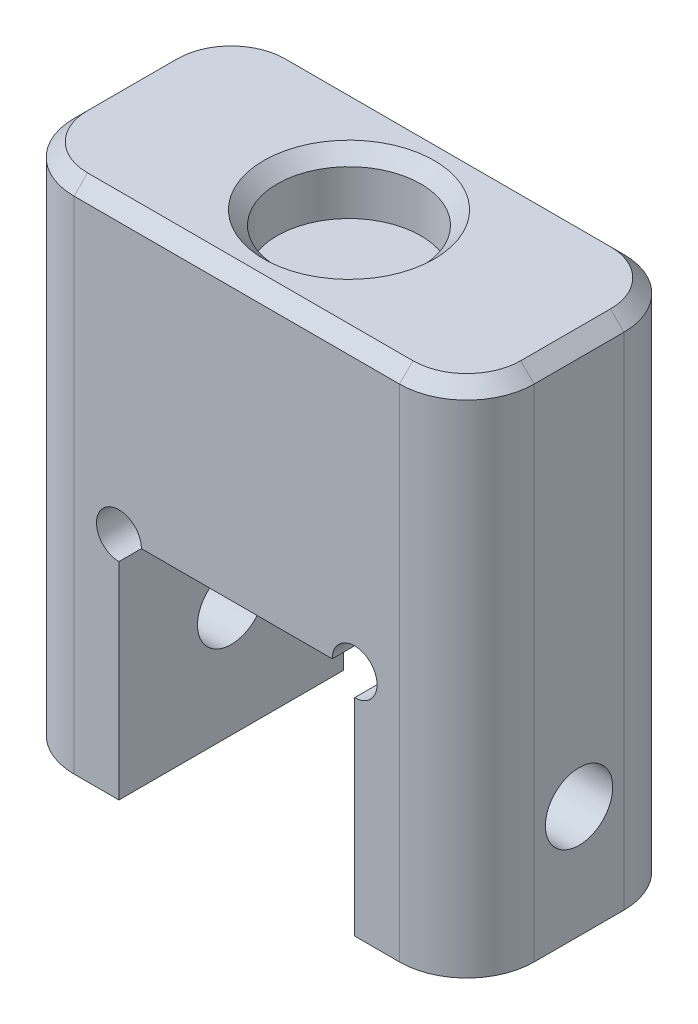
ISO-10303-21;
HEADER;
FILE_DESCRIPTION(('STEP AP214'),'2;1');
FILE_NAME('part.step','',(''),(''),'','','');
FILE_SCHEMA(('AUTOMOTIVE_DESIGN { 1 0 10303 214 1 1 1 1 }'));
ENDSEC;
DATA;
#1=APPLICATION_CONTEXT('core data for automotive mechanical design processes');
#2=APPLICATION_PROTOCOL_DEFINITION('international standard','automotive_design',2000,#1);
#3=PRODUCT_CONTEXT('',#1,'mechanical');
#4=PRODUCT('Part','Part','',(#3));
#5=PRODUCT_RELATED_PRODUCT_CATEGORY('part','',(#4));
#6=PRODUCT_DEFINITION_FORMATION('','',#4);
#7=PRODUCT_DEFINITION_CONTEXT('part definition',#1,'design');
#8=PRODUCT_DEFINITION('design','',#6,#7);
#9=PRODUCT_DEFINITION_SHAPE('','',#8);
#10=(LENGTH_UNIT() NAMED_UNIT(*) SI_UNIT(.MILLI.,.METRE.));
#11=(NAMED_UNIT(*) PLANE_ANGLE_UNIT() SI_UNIT($,.RADIAN.));
#12=(NAMED_UNIT(*) SI_UNIT($,.STERADIAN.) SOLID_ANGLE_UNIT());
#13=UNCERTAINTY_MEASURE_WITH_UNIT(LENGTH_MEASURE(1.E-05),#10,'distance_accuracy_value','');
#14=(GEOMETRIC_REPRESENTATION_CONTEXT(3) GLOBAL_UNCERTAINTY_ASSIGNED_CONTEXT((#13)) GLOBAL_UNIT_ASSIGNED_CONTEXT((#10,
#11,#12)) REPRESENTATION_CONTEXT('',''));
#15=CARTESIAN_POINT('',(0.,0.,0.));
#16=DIRECTION('',(0.,0.,1.));
#17=DIRECTION('',(1.,0.,0.));
#18=AXIS2_PLACEMENT_3D('',#15,#16,#17);
#19=CARTESIAN_POINT('',(0.,-1.24999999999999,10.));
#20=DIRECTION('',(0.,1.,0.));
#21=DIRECTION('',(0.,0.,1.));
#22=AXIS2_PLACEMENT_3D('',#19,#20,#21);
#23=PLANE('',#22);
#24=DIRECTION('',(1.,0.,0.));
#25=VECTOR('',#24,1.);
#26=CARTESIAN_POINT('',(0.,-1.24999999999999,0.));
#27=LINE('',#26,#25);
#28=CARTESIAN_POINT('',(-4.24999999999999,-1.24999999999999,0.));
#29=VERTEX_POINT('',#28);
#30=CARTESIAN_POINT('',(4.25000000000001,-1.24999999999999,0.));
#31=VERTEX_POINT('',#30);
#32=EDGE_CURVE('E188',#29,#31,#27,.T.);
#33=ORIENTED_EDGE('',*,*,#32,.T.);
#34=DIRECTION('',(0.,0.,1.));
#35=VECTOR('',#34,1.);
#36=CARTESIAN_POINT('',(4.25000000000001,-1.24999999999999,0.));
#37=LINE('',#36,#35);
#38=CARTESIAN_POINT('',(4.25000000000001,-1.24999999999999,10.));
#39=VERTEX_POINT('',#38);
#40=EDGE_CURVE('E322',#31,#39,#37,.T.);
#41=ORIENTED_EDGE('',*,*,#40,.T.);
#42=DIRECTION('',(1.,0.,0.));
#43=VECTOR('',#42,1.);
#44=CARTESIAN_POINT('',(0.,-1.24999999999999,10.));
#45=LINE('',#44,#43);
#46=CARTESIAN_POINT('',(-4.24999999999999,-1.24999999999999,10.));
#47=VERTEX_POINT('',#46);
#48=EDGE_CURVE('E190',#47,#39,#45,.T.);
#49=ORIENTED_EDGE('',*,*,#48,.F.);
#50=DIRECTION('',(0.,0.,1.));
#51=VECTOR('',#50,1.);
#52=CARTESIAN_POINT('',(-4.24999999999999,-1.24999999999999,0.));
#53=LINE('',#52,#51);
#54=EDGE_CURVE('E173',#47,#29,#53,.F.);
#55=ORIENTED_EDGE('',*,*,#54,.T.);
#56=EDGE_LOOP('',(#33,#41,#49,#55));
#57=FACE_BOUND('',#56,.T.);
#58=ADVANCED_FACE('F41',(#57),#23,.F.);
#59=CARTESIAN_POINT('',(5.25000000000001,0.,10.));
#60=DIRECTION('',(1.,0.,0.));
#61=DIRECTION('',(0.,1.,0.));
#62=AXIS2_PLACEMENT_3D('',#59,#60,#61);
#63=PLANE('',#62);
#64=CARTESIAN_POINT('',(5.25000000000001,-6.44999999999999,5.));
#65=DIRECTION('',(1.,0.,0.));
#66=DIRECTION('',(0.,1.,0.));
#67=AXIS2_PLACEMENT_3D('',#64,#65,#66);
#68=CIRCLE('',#67,1.5);
#69=CARTESIAN_POINT('',(5.25000000000001,-4.94999999999999,5.));
#70=VERTEX_POINT('',#69);
#71=EDGE_CURVE('E203',#70,#70,#68,.T.);
#72=ORIENTED_EDGE('',*,*,#71,.T.);
#73=EDGE_LOOP('',(#72));
#74=FACE_BOUND('',#73,.T.);
#75=DIRECTION('',(0.,-1.,0.));
#76=VECTOR('',#75,1.);
#77=CARTESIAN_POINT('',(5.25000000000001,0.,10.));
#78=LINE('',#77,#76);
#79=CARTESIAN_POINT('',(5.25000000000001,-2.24999999999999,10.));
#80=VERTEX_POINT('',#79);
#81=CARTESIAN_POINT('',(5.25000000000001,-11.45,10.));
#82=VERTEX_POINT('',#81);
#83=EDGE_CURVE('E332',#80,#82,#78,.T.);
#84=ORIENTED_EDGE('',*,*,#83,.F.);
#85=DIRECTION('',(0.,0.,1.));
#86=VECTOR('',#85,1.);
#87=CARTESIAN_POINT('',(5.25000000000001,-2.24999999999999,0.));
#88=LINE('',#87,#86);
#89=CARTESIAN_POINT('',(5.25000000000001,-2.24999999999999,0.));
#90=VERTEX_POINT('',#89);
#91=EDGE_CURVE('E191',#80,#90,#88,.F.);
#92=ORIENTED_EDGE('',*,*,#91,.T.);
#93=DIRECTION('',(0.,-1.,0.));
#94=VECTOR('',#93,1.);
#95=CARTESIAN_POINT('',(5.25000000000001,0.,0.));
#96=LINE('',#95,#94);
#97=CARTESIAN_POINT('',(5.25000000000001,-11.45,0.));
#98=VERTEX_POINT('',#97);
#99=EDGE_CURVE('E197',#90,#98,#96,.T.);
#100=ORIENTED_EDGE('',*,*,#99,.T.);
#101=DIRECTION('',(0.,0.,-1.));
#102=VECTOR('',#101,1.);
#103=CARTESIAN_POINT('',(5.25000000000001,-11.45,10.));
#104=LINE('',#103,#102);
#105=EDGE_CURVE('E223',#82,#98,#104,.T.);
#106=ORIENTED_EDGE('',*,*,#105,.F.);
#107=EDGE_LOOP('',(#84,#92,#100,#106));
#108=FACE_BOUND('',#107,.T.);
#109=ADVANCED_FACE('F431',(#74,#108),#63,.F.);
#110=CARTESIAN_POINT('',(0.,-11.45,10.));
#111=DIRECTION('',(0.,1.,0.));
#112=DIRECTION('',(-1.,0.,0.));
#113=AXIS2_PLACEMENT_3D('',#110,#111,#112);
#114=PLANE('',#113);
#115=DIRECTION('',(1.,0.,0.));
#116=VECTOR('',#115,1.);
#117=CARTESIAN_POINT('',(0.,-11.45,0.));
#118=LINE('',#117,#116);
#119=CARTESIAN_POINT('',(7.25000000000001,-11.45,0.));
#120=VERTEX_POINT('',#119);
#121=EDGE_CURVE('E200',#98,#120,#118,.T.);
#122=ORIENTED_EDGE('',*,*,#121,.T.);
#123=CARTESIAN_POINT('',(7.25000000000001,-11.45,3.));
#124=DIRECTION('',(0.,1.,0.));
#125=DIRECTION('',(-1.,0.,0.));
#126=AXIS2_PLACEMENT_3D('',#123,#124,#125);
#127=CIRCLE('',#126,3.);
#128=CARTESIAN_POINT('',(10.25,-11.45,3.));
#129=VERTEX_POINT('',#128);
#130=EDGE_CURVE('E255',#120,#129,#127,.F.);
#131=ORIENTED_EDGE('',*,*,#130,.T.);
#132=DIRECTION('',(0.,0.,-1.));
#133=VECTOR('',#132,1.);
#134=CARTESIAN_POINT('',(10.25,-11.45,10.));
#135=LINE('',#134,#133);
#136=CARTESIAN_POINT('',(10.25,-11.45,7.));
#137=VERTEX_POINT('',#136);
#138=EDGE_CURVE('E220',#137,#129,#135,.T.);
#139=ORIENTED_EDGE('',*,*,#138,.F.);
#140=CARTESIAN_POINT('',(7.25000000000001,-11.45,7.));
#141=DIRECTION('',(0.,1.,0.));
#142=DIRECTION('',(-1.,0.,0.));
#143=AXIS2_PLACEMENT_3D('',#140,#141,#142);
#144=CIRCLE('',#143,3.);
#145=CARTESIAN_POINT('',(7.25000000000001,-11.45,10.));
#146=VERTEX_POINT('',#145);
#147=EDGE_CURVE('E253',#137,#146,#144,.F.);
#148=ORIENTED_EDGE('',*,*,#147,.T.);
#149=DIRECTION('',(1.,0.,0.));
#150=VECTOR('',#149,1.);
#151=CARTESIAN_POINT('',(0.,-11.45,10.));
#152=LINE('',#151,#150);
#153=EDGE_CURVE('E333',#82,#146,#152,.T.);
#154=ORIENTED_EDGE('',*,*,#153,.F.);
#155=ORIENTED_EDGE('',*,*,#105,.T.);
#156=EDGE_LOOP('',(#122,#131,#139,#148,#154,#155));
#157=FACE_BOUND('',#156,.T.);
#158=ADVANCED_FACE('F436',(#157),#114,.F.);
#159=CARTESIAN_POINT('',(10.25,0.,10.));
#160=DIRECTION('',(-1.,0.,0.));
#161=DIRECTION('',(0.,-1.,0.));
#162=AXIS2_PLACEMENT_3D('',#159,#160,#161);
#163=PLANE('',#162);
#164=CARTESIAN_POINT('',(10.25,-6.44999999999999,5.));
#165=DIRECTION('',(1.,0.,0.));
#166=DIRECTION('',(0.,1.,0.));
#167=AXIS2_PLACEMENT_3D('',#164,#165,#166);
#168=CIRCLE('',#167,1.5);
#169=CARTESIAN_POINT('',(10.25,-4.94999999999999,5.));
#170=VERTEX_POINT('',#169);
#171=EDGE_CURVE('E324',#170,#170,#168,.T.);
#172=ORIENTED_EDGE('',*,*,#171,.F.);
#173=EDGE_LOOP('',(#172));
#174=FACE_BOUND('',#173,.T.);
#175=DIRECTION('',(0.,1.,0.));
#176=VECTOR('',#175,1.);
#177=CARTESIAN_POINT('',(10.25,0.,3.));
#178=LINE('',#177,#176);
#179=CARTESIAN_POINT('',(10.25,10.85,3.));
#180=VERTEX_POINT('',#179);
#181=EDGE_CURVE('E250',#129,#180,#178,.T.);
#182=ORIENTED_EDGE('',*,*,#181,.T.);
#183=DIRECTION('',(0.,0.,1.));
#184=VECTOR('',#183,1.);
#185=CARTESIAN_POINT('',(10.25,10.85,7.));
#186=LINE('',#185,#184);
#187=CARTESIAN_POINT('',(10.25,10.85,7.));
#188=VERTEX_POINT('',#187);
#189=EDGE_CURVE('E280',#180,#188,#186,.T.);
#190=ORIENTED_EDGE('',*,*,#189,.T.);
#191=DIRECTION('',(0.,1.,0.));
#192=VECTOR('',#191,1.);
#193=CARTESIAN_POINT('',(10.25,-11.45,7.));
#194=LINE('',#193,#192);
#195=EDGE_CURVE('E248',#188,#137,#194,.F.);
#196=ORIENTED_EDGE('',*,*,#195,.T.);
#197=ORIENTED_EDGE('',*,*,#138,.T.);
#198=EDGE_LOOP('',(#182,#190,#196,#197));
#199=FACE_BOUND('',#198,.T.);
#200=ADVANCED_FACE('F382',(#174,#199),#163,.F.);
#201=CARTESIAN_POINT('',(0.,11.45,10.));
#202=DIRECTION('',(0.,1.,0.));
#203=DIRECTION('',(-1.,0.,0.));
#204=AXIS2_PLACEMENT_3D('',#201,#202,#203);
#205=PLANE('',#204);
#206=DIRECTION('',(0.,0.,-1.));
#207=VECTOR('',#206,1.);
#208=CARTESIAN_POINT('',(9.65000000000001,11.45,3.));
#209=LINE('',#208,#207);
#210=CARTESIAN_POINT('',(9.65000000000001,11.45,7.));
#211=VERTEX_POINT('',#210);
#212=CARTESIAN_POINT('',(9.65000000000001,11.45,3.));
#213=VERTEX_POINT('',#212);
#214=EDGE_CURVE('E272',#211,#213,#209,.T.);
#215=ORIENTED_EDGE('',*,*,#214,.T.);
#216=CARTESIAN_POINT('',(7.25000000000001,11.45,3.));
#217=DIRECTION('',(0.,1.,0.));
#218=DIRECTION('',(-1.,0.,0.));
#219=AXIS2_PLACEMENT_3D('',#216,#217,#218);
#220=CIRCLE('',#219,2.4);
#221=CARTESIAN_POINT('',(7.25000000000001,11.45,0.6));
#222=VERTEX_POINT('',#221);
#223=EDGE_CURVE('E274',#213,#222,#220,.T.);
#224=ORIENTED_EDGE('',*,*,#223,.T.);
#225=DIRECTION('',(-1.,0.,0.));
#226=VECTOR('',#225,1.);
#227=CARTESIAN_POINT('',(-7.25000000000001,11.45,0.6));
#228=LINE('',#227,#226);
#229=CARTESIAN_POINT('',(-7.25000000000001,11.45,0.6));
#230=VERTEX_POINT('',#229);
#231=EDGE_CURVE('E260',#222,#230,#228,.T.);
#232=ORIENTED_EDGE('',*,*,#231,.T.);
#233=CARTESIAN_POINT('',(-7.25000000000001,11.45,3.));
#234=DIRECTION('',(0.,1.,0.));
#235=DIRECTION('',(-1.,0.,0.));
#236=AXIS2_PLACEMENT_3D('',#233,#234,#235);
#237=CIRCLE('',#236,2.4);
#238=CARTESIAN_POINT('',(-9.65000000000001,11.45,3.));
#239=VERTEX_POINT('',#238);
#240=EDGE_CURVE('E262',#230,#239,#237,.T.);
#241=ORIENTED_EDGE('',*,*,#240,.T.);
#242=DIRECTION('',(0.,0.,1.));
#243=VECTOR('',#242,1.);
#244=CARTESIAN_POINT('',(-9.65000000000001,11.45,10.));
#245=LINE('',#244,#243);
#246=CARTESIAN_POINT('',(-9.65000000000001,11.45,7.));
#247=VERTEX_POINT('',#246);
#248=EDGE_CURVE('E264',#239,#247,#245,.T.);
#249=ORIENTED_EDGE('',*,*,#248,.T.);
#250=CARTESIAN_POINT('',(-7.25000000000001,11.45,7.));
#251=DIRECTION('',(0.,1.,0.));
#252=DIRECTION('',(-1.,0.,0.));
#253=AXIS2_PLACEMENT_3D('',#250,#251,#252);
#254=CIRCLE('',#253,2.4);
#255=CARTESIAN_POINT('',(-7.25000000000001,11.45,9.4));
#256=VERTEX_POINT('',#255);
#257=EDGE_CURVE('E266',#247,#256,#254,.T.);
#258=ORIENTED_EDGE('',*,*,#257,.T.);
#259=DIRECTION('',(1.,0.,0.));
#260=VECTOR('',#259,1.);
#261=CARTESIAN_POINT('',(0.,11.45,9.4));
#262=LINE('',#261,#260);
#263=CARTESIAN_POINT('',(7.25000000000001,11.45,9.4));
#264=VERTEX_POINT('',#263);
#265=EDGE_CURVE('E268',#256,#264,#262,.T.);
#266=ORIENTED_EDGE('',*,*,#265,.T.);
#267=CARTESIAN_POINT('',(7.25000000000001,11.45,7.));
#268=DIRECTION('',(0.,1.,0.));
#269=DIRECTION('',(-1.,0.,0.));
#270=AXIS2_PLACEMENT_3D('',#267,#268,#269);
#271=CIRCLE('',#270,2.4);
#272=EDGE_CURVE('E270',#264,#211,#271,.T.);
#273=ORIENTED_EDGE('',*,*,#272,.T.);
#274=EDGE_LOOP('',(#215,#224,#232,#241,#249,#258,#266,#273));
#275=FACE_BOUND('',#274,.T.);
#276=CARTESIAN_POINT('',(0.,11.45,5.));
#277=DIRECTION('',(0.,1.,0.));
#278=DIRECTION('',(-1.,0.,0.));
#279=AXIS2_PLACEMENT_3D('',#276,#277,#278);
#280=CIRCLE('',#279,3.8);
#281=CARTESIAN_POINT('',(-3.8,11.45,5.));
#282=VERTEX_POINT('',#281);
#283=EDGE_CURVE('E257',#282,#282,#280,.F.);
#284=ORIENTED_EDGE('',*,*,#283,.T.);
#285=EDGE_LOOP('',(#284));
#286=FACE_BOUND('',#285,.T.);
#287=ADVANCED_FACE('F403',(#275,#286),#205,.T.);
#288=CARTESIAN_POINT('',(-10.25,0.,10.));
#289=DIRECTION('',(-1.,0.,0.));
#290=DIRECTION('',(0.,-1.,0.));
#291=AXIS2_PLACEMENT_3D('',#288,#289,#290);
#292=PLANE('',#291);
#293=CARTESIAN_POINT('',(-10.25,-6.44999999999999,5.));
#294=DIRECTION('',(1.,0.,0.));
#295=DIRECTION('',(0.,1.,0.));
#296=AXIS2_PLACEMENT_3D('',#293,#294,#295);
#297=CIRCLE('',#296,1.5);
#298=CARTESIAN_POINT('',(-10.25,-4.94999999999999,5.));
#299=VERTEX_POINT('',#298);
#300=EDGE_CURVE('E229',#299,#299,#297,.T.);
#301=ORIENTED_EDGE('',*,*,#300,.T.);
#302=EDGE_LOOP('',(#301));
#303=FACE_BOUND('',#302,.T.);
#304=DIRECTION('',(0.,1.,0.));
#305=VECTOR('',#304,1.);
#306=CARTESIAN_POINT('',(-10.25,0.,7.));
#307=LINE('',#306,#305);
#308=CARTESIAN_POINT('',(-10.25,-11.45,7.));
#309=VERTEX_POINT('',#308);
#310=CARTESIAN_POINT('',(-10.25,10.85,7.));
#311=VERTEX_POINT('',#310);
#312=EDGE_CURVE('E235',#309,#311,#307,.T.);
#313=ORIENTED_EDGE('',*,*,#312,.T.);
#314=DIRECTION('',(0.,0.,-1.));
#315=VECTOR('',#314,1.);
#316=CARTESIAN_POINT('',(-10.25,10.85,10.));
#317=LINE('',#316,#315);
#318=CARTESIAN_POINT('',(-10.25,10.85,3.));
#319=VERTEX_POINT('',#318);
#320=EDGE_CURVE('E67',#311,#319,#317,.T.);
#321=ORIENTED_EDGE('',*,*,#320,.T.);
#322=DIRECTION('',(0.,1.,0.));
#323=VECTOR('',#322,1.);
#324=CARTESIAN_POINT('',(-10.25,-11.45,3.));
#325=LINE('',#324,#323);
#326=CARTESIAN_POINT('',(-10.25,-11.45,3.));
#327=VERTEX_POINT('',#326);
#328=EDGE_CURVE('E237',#319,#327,#325,.F.);
#329=ORIENTED_EDGE('',*,*,#328,.T.);
#330=DIRECTION('',(0.,0.,-1.));
#331=VECTOR('',#330,1.);
#332=CARTESIAN_POINT('',(-10.25,-11.45,10.));
#333=LINE('',#332,#331);
#334=EDGE_CURVE('E217',#309,#327,#333,.T.);
#335=ORIENTED_EDGE('',*,*,#334,.F.);
#336=EDGE_LOOP('',(#313,#321,#329,#335));
#337=FACE_BOUND('',#336,.T.);
#338=ADVANCED_FACE('F406',(#303,#337),#292,.T.);
#339=ORIENTED_EDGE('',*,*,#334,.T.);
#340=CARTESIAN_POINT('',(-7.25,-11.45,3.));
#341=DIRECTION('',(0.,1.,0.));
#342=DIRECTION('',(-1.,0.,0.));
#343=AXIS2_PLACEMENT_3D('',#340,#341,#342);
#344=CIRCLE('',#343,3.);
#345=CARTESIAN_POINT('',(-7.25,-11.45,0.));
#346=VERTEX_POINT('',#345);
#347=EDGE_CURVE('E241',#327,#346,#344,.F.);
#348=ORIENTED_EDGE('',*,*,#347,.T.);
#349=CARTESIAN_POINT('',(-5.24999999999999,-11.45,0.));
#350=VERTEX_POINT('',#349);
#351=EDGE_CURVE('E211',#346,#350,#118,.T.);
#352=ORIENTED_EDGE('',*,*,#351,.T.);
#353=DIRECTION('',(0.,0.,-1.));
#354=VECTOR('',#353,1.);
#355=CARTESIAN_POINT('',(-5.24999999999999,-11.45,10.));
#356=LINE('',#355,#354);
#357=CARTESIAN_POINT('',(-5.24999999999999,-11.45,10.));
#358=VERTEX_POINT('',#357);
#359=EDGE_CURVE('E214',#358,#350,#356,.T.);
#360=ORIENTED_EDGE('',*,*,#359,.F.);
#361=CARTESIAN_POINT('',(-7.25,-11.45,10.));
#362=VERTEX_POINT('',#361);
#363=EDGE_CURVE('E335',#362,#358,#152,.T.);
#364=ORIENTED_EDGE('',*,*,#363,.F.);
#365=CARTESIAN_POINT('',(-7.25,-11.45,7.));
#366=DIRECTION('',(0.,1.,0.));
#367=DIRECTION('',(-1.,0.,0.));
#368=AXIS2_PLACEMENT_3D('',#365,#366,#367);
#369=CIRCLE('',#368,3.);
#370=EDGE_CURVE('E239',#362,#309,#369,.F.);
#371=ORIENTED_EDGE('',*,*,#370,.T.);
#372=EDGE_LOOP('',(#339,#348,#352,#360,#364,#371));
#373=FACE_BOUND('',#372,.T.);
#374=ADVANCED_FACE('F347',(#373),#114,.F.);
#375=CARTESIAN_POINT('',(-5.25,0.,10.));
#376=DIRECTION('',(1.,0.,0.));
#377=DIRECTION('',(0.,1.,0.));
#378=AXIS2_PLACEMENT_3D('',#375,#376,#377);
#379=PLANE('',#378);
#380=DIRECTION('',(0.,0.,1.));
#381=VECTOR('',#380,1.);
#382=CARTESIAN_POINT('',(-5.25,-2.24999999999999,0.));
#383=LINE('',#382,#381);
#384=CARTESIAN_POINT('',(-5.25,-2.24999999999999,10.));
#385=VERTEX_POINT('',#384);
#386=CARTESIAN_POINT('',(-5.25,-2.24999999999999,0.));
#387=VERTEX_POINT('',#386);
#388=EDGE_CURVE('E176',#385,#387,#383,.F.);
#389=ORIENTED_EDGE('',*,*,#388,.F.);
#390=DIRECTION('',(0.,-1.,0.));
#391=VECTOR('',#390,1.);
#392=CARTESIAN_POINT('',(-5.25,0.,10.));
#393=LINE('',#392,#391);
#394=EDGE_CURVE('E206',#385,#358,#393,.T.);
#395=ORIENTED_EDGE('',*,*,#394,.T.);
#396=ORIENTED_EDGE('',*,*,#359,.T.);
#397=DIRECTION('',(0.,-1.,0.));
#398=VECTOR('',#397,1.);
#399=CARTESIAN_POINT('',(-5.25,0.,0.));
#400=LINE('',#399,#398);
#401=EDGE_CURVE('E212',#387,#350,#400,.T.);
#402=ORIENTED_EDGE('',*,*,#401,.F.);
#403=EDGE_LOOP('',(#389,#395,#396,#402));
#404=FACE_BOUND('',#403,.T.);
#405=CARTESIAN_POINT('',(-5.24999999999999,-6.44999999999999,5.));
#406=DIRECTION('',(1.,0.,0.));
#407=DIRECTION('',(0.,1.,0.));
#408=AXIS2_PLACEMENT_3D('',#405,#406,#407);
#409=CIRCLE('',#408,1.5);
#410=CARTESIAN_POINT('',(-5.24999999999999,-4.94999999999999,5.));
#411=VERTEX_POINT('',#410);
#412=EDGE_CURVE('E226',#411,#411,#409,.T.);
#413=ORIENTED_EDGE('',*,*,#412,.F.);
#414=EDGE_LOOP('',(#413));
#415=FACE_BOUND('',#414,.T.);
#416=ADVANCED_FACE('F344',(#404,#415),#379,.T.);
#417=CARTESIAN_POINT('',(0.,0.,10.));
#418=DIRECTION('',(0.,0.,1.));
#419=DIRECTION('',(1.,0.,0.));
#420=AXIS2_PLACEMENT_3D('',#417,#418,#419);
#421=PLANE('',#420);
#422=DIRECTION('',(0.,1.,0.));
#423=VECTOR('',#422,1.);
#424=CARTESIAN_POINT('',(7.25000000000001,11.45,10.));
#425=LINE('',#424,#423);
#426=CARTESIAN_POINT('',(7.25000000000001,10.85,10.));
#427=VERTEX_POINT('',#426);
#428=EDGE_CURVE('E243',#146,#427,#425,.T.);
#429=ORIENTED_EDGE('',*,*,#428,.T.);
#430=DIRECTION('',(-1.,0.,0.));
#431=VECTOR('',#430,1.);
#432=CARTESIAN_POINT('',(0.,10.85,10.));
#433=LINE('',#432,#431);
#434=CARTESIAN_POINT('',(-7.25000000000001,10.85,10.));
#435=VERTEX_POINT('',#434);
#436=EDGE_CURVE('E284',#427,#435,#433,.T.);
#437=ORIENTED_EDGE('',*,*,#436,.T.);
#438=DIRECTION('',(0.,1.,0.));
#439=VECTOR('',#438,1.);
#440=CARTESIAN_POINT('',(-7.25000000000001,0.,10.));
#441=LINE('',#440,#439);
#442=EDGE_CURVE('E246',#435,#362,#441,.F.);
#443=ORIENTED_EDGE('',*,*,#442,.T.);
#444=ORIENTED_EDGE('',*,*,#363,.T.);
#445=ORIENTED_EDGE('',*,*,#394,.F.);
#446=CARTESIAN_POINT('',(-5.25,-1.24999999999999,10.));
#447=DIRECTION('',(0.,0.,1.));
#448=DIRECTION('',(1.,0.,0.));
#449=AXIS2_PLACEMENT_3D('',#446,#447,#448);
#450=CIRCLE('',#449,1.);
#451=EDGE_CURVE('E182',#47,#385,#450,.T.);
#452=ORIENTED_EDGE('',*,*,#451,.F.);
#453=ORIENTED_EDGE('',*,*,#48,.T.);
#454=CARTESIAN_POINT('',(5.25000000000001,-1.24999999999999,10.));
#455=DIRECTION('',(0.,0.,1.));
#456=DIRECTION('',(1.,0.,0.));
#457=AXIS2_PLACEMENT_3D('',#454,#455,#456);
#458=CIRCLE('',#457,1.);
#459=EDGE_CURVE('E181',#80,#39,#458,.T.);
#460=ORIENTED_EDGE('',*,*,#459,.F.);
#461=ORIENTED_EDGE('',*,*,#83,.T.);
#462=ORIENTED_EDGE('',*,*,#153,.T.);
#463=EDGE_LOOP('',(#429,#437,#443,#444,#445,#452,#453,#460,#461,#462));
#464=FACE_BOUND('',#463,.T.);
#465=ADVANCED_FACE('F394',(#464),#421,.T.);
#466=CARTESIAN_POINT('',(0.,0.,0.));
#467=DIRECTION('',(0.,0.,1.));
#468=DIRECTION('',(1.,0.,0.));
#469=AXIS2_PLACEMENT_3D('',#466,#467,#468);
#470=PLANE('',#469);
#471=DIRECTION('',(0.,1.,0.));
#472=VECTOR('',#471,1.);
#473=CARTESIAN_POINT('',(-7.25000000000001,11.45,0.));
#474=LINE('',#473,#472);
#475=CARTESIAN_POINT('',(-7.25000000000001,10.85,0.));
#476=VERTEX_POINT('',#475);
#477=EDGE_CURVE('E233',#346,#476,#474,.T.);
#478=ORIENTED_EDGE('',*,*,#477,.T.);
#479=DIRECTION('',(1.,0.,0.));
#480=VECTOR('',#479,1.);
#481=CARTESIAN_POINT('',(7.25000000000001,10.85,0.));
#482=LINE('',#481,#480);
#483=CARTESIAN_POINT('',(7.25000000000001,10.85,0.));
#484=VERTEX_POINT('',#483);
#485=EDGE_CURVE('E51',#476,#484,#482,.T.);
#486=ORIENTED_EDGE('',*,*,#485,.T.);
#487=DIRECTION('',(0.,1.,0.));
#488=VECTOR('',#487,1.);
#489=CARTESIAN_POINT('',(7.25000000000001,0.,0.));
#490=LINE('',#489,#488);
#491=EDGE_CURVE('E231',#484,#120,#490,.F.);
#492=ORIENTED_EDGE('',*,*,#491,.T.);
#493=ORIENTED_EDGE('',*,*,#121,.F.);
#494=ORIENTED_EDGE('',*,*,#99,.F.);
#495=CARTESIAN_POINT('',(5.25000000000001,-1.24999999999999,0.));
#496=DIRECTION('',(0.,0.,1.));
#497=DIRECTION('',(1.,0.,0.));
#498=AXIS2_PLACEMENT_3D('',#495,#496,#497);
#499=CIRCLE('',#498,1.);
#500=EDGE_CURVE('E196',#90,#31,#499,.T.);
#501=ORIENTED_EDGE('',*,*,#500,.T.);
#502=ORIENTED_EDGE('',*,*,#32,.F.);
#503=CARTESIAN_POINT('',(-5.25,-1.24999999999999,0.));
#504=DIRECTION('',(0.,0.,1.));
#505=DIRECTION('',(1.,0.,0.));
#506=AXIS2_PLACEMENT_3D('',#503,#504,#505);
#507=CIRCLE('',#506,1.);
#508=EDGE_CURVE('E170',#29,#387,#507,.T.);
#509=ORIENTED_EDGE('',*,*,#508,.T.);
#510=ORIENTED_EDGE('',*,*,#401,.T.);
#511=ORIENTED_EDGE('',*,*,#351,.F.);
#512=EDGE_LOOP('',(#478,#486,#492,#493,#494,#501,#502,#509,#510,#511));
#513=FACE_BOUND('',#512,.T.);
#514=ADVANCED_FACE('F194',(#513),#470,.F.);
#515=CARTESIAN_POINT('',(0.,8.85000000000001,5.));
#516=DIRECTION('',(0.,1.,0.));
#517=DIRECTION('',(-1.,0.,0.));
#518=AXIS2_PLACEMENT_3D('',#515,#516,#517);
#519=CYLINDRICAL_SURFACE('',#518,3.2);
#520=CARTESIAN_POINT('',(0.,10.85,5.));
#521=DIRECTION('',(0.,1.,0.));
#522=DIRECTION('',(-1.,0.,0.));
#523=AXIS2_PLACEMENT_3D('',#520,#521,#522);
#524=CIRCLE('',#523,3.2);
#525=CARTESIAN_POINT('',(-3.2,10.85,5.));
#526=VERTEX_POINT('',#525);
#527=EDGE_CURVE('E11',#526,#526,#524,.T.);
#528=ORIENTED_EDGE('',*,*,#527,.T.);
#529=EDGE_LOOP('',(#528));
#530=FACE_BOUND('',#529,.T.);
#531=CARTESIAN_POINT('',(0.,8.85000000000001,5.));
#532=DIRECTION('',(0.,1.,0.));
#533=DIRECTION('',(-1.,0.,0.));
#534=AXIS2_PLACEMENT_3D('',#531,#532,#533);
#535=CIRCLE('',#534,3.2);
#536=CARTESIAN_POINT('',(-3.2,8.85000000000001,5.));
#537=VERTEX_POINT('',#536);
#538=EDGE_CURVE('E198',#537,#537,#535,.T.);
#539=ORIENTED_EDGE('',*,*,#538,.F.);
#540=EDGE_LOOP('',(#539));
#541=FACE_BOUND('',#540,.T.);
#542=ADVANCED_FACE('F414',(#530,#541),#519,.F.);
#543=CARTESIAN_POINT('',(0.,8.85000000000001,5.));
#544=DIRECTION('',(0.,1.,0.));
#545=DIRECTION('',(-1.,0.,0.));
#546=AXIS2_PLACEMENT_3D('',#543,#544,#545);
#547=PLANE('',#546);
#548=ORIENTED_EDGE('',*,*,#538,.T.);
#549=EDGE_LOOP('',(#548));
#550=FACE_BOUND('',#549,.T.);
#551=ADVANCED_FACE('F417',(#550),#547,.T.);
#552=CARTESIAN_POINT('',(-10.25,-6.44999999999999,5.));
#553=DIRECTION('',(1.,0.,0.));
#554=DIRECTION('',(0.,1.,0.));
#555=AXIS2_PLACEMENT_3D('',#552,#553,#554);
#556=CYLINDRICAL_SURFACE('',#555,1.5);
#557=CARTESIAN_POINT('',(-5.24999999999999,-4.94999999999999,5.));
#558=CARTESIAN_POINT('',(-5.30208333333333,-4.94999999999999,5.));
#559=CARTESIAN_POINT('',(-5.35416666666666,-4.94999999999999,5.));
#560=CARTESIAN_POINT('',(-5.45833333333333,-4.94999999999999,5.));
#561=CARTESIAN_POINT('',(-5.51041666666666,-4.94999999999999,5.));
#562=CARTESIAN_POINT('',(-5.61458333333333,-4.94999999999999,5.));
#563=CARTESIAN_POINT('',(-5.66666666666666,-4.94999999999999,5.));
#564=CARTESIAN_POINT('',(-5.77083333333333,-4.94999999999999,5.));
#565=CARTESIAN_POINT('',(-5.82291666666666,-4.94999999999999,5.));
#566=CARTESIAN_POINT('',(-5.92708333333333,-4.94999999999999,5.));
#567=CARTESIAN_POINT('',(-5.97916666666666,-4.94999999999999,5.));
#568=CARTESIAN_POINT('',(-6.08333333333333,-4.94999999999999,5.));
#569=CARTESIAN_POINT('',(-6.13541666666666,-4.94999999999999,5.));
#570=CARTESIAN_POINT('',(-6.23958333333333,-4.94999999999999,5.));
#571=CARTESIAN_POINT('',(-6.29166666666666,-4.94999999999999,5.));
#572=CARTESIAN_POINT('',(-6.39583333333333,-4.94999999999999,5.));
#573=CARTESIAN_POINT('',(-6.44791666666667,-4.94999999999999,5.));
#574=CARTESIAN_POINT('',(-6.55208333333333,-4.94999999999999,5.));
#575=CARTESIAN_POINT('',(-6.60416666666667,-4.94999999999999,5.));
#576=CARTESIAN_POINT('',(-6.70833333333333,-4.94999999999999,5.));
#577=CARTESIAN_POINT('',(-6.76041666666667,-4.94999999999999,5.));
#578=CARTESIAN_POINT('',(-6.86458333333333,-4.94999999999999,5.));
#579=CARTESIAN_POINT('',(-6.91666666666667,-4.94999999999999,5.));
#580=CARTESIAN_POINT('',(-7.02083333333333,-4.94999999999999,5.));
#581=CARTESIAN_POINT('',(-7.07291666666667,-4.94999999999999,5.));
#582=CARTESIAN_POINT('',(-7.17708333333333,-4.94999999999999,5.));
#583=CARTESIAN_POINT('',(-7.22916666666667,-4.94999999999999,5.));
#584=CARTESIAN_POINT('',(-7.33333333333333,-4.94999999999999,5.));
#585=CARTESIAN_POINT('',(-7.38541666666667,-4.94999999999999,5.));
#586=CARTESIAN_POINT('',(-7.48958333333334,-4.94999999999999,5.));
#587=CARTESIAN_POINT('',(-7.54166666666667,-4.94999999999999,5.));
#588=CARTESIAN_POINT('',(-7.64583333333334,-4.94999999999999,5.));
#589=CARTESIAN_POINT('',(-7.69791666666667,-4.94999999999999,5.));
#590=CARTESIAN_POINT('',(-7.80208333333334,-4.94999999999999,5.));
#591=CARTESIAN_POINT('',(-7.85416666666667,-4.94999999999999,5.));
#592=CARTESIAN_POINT('',(-7.95833333333334,-4.94999999999999,5.));
#593=CARTESIAN_POINT('',(-8.01041666666667,-4.94999999999999,5.));
#594=CARTESIAN_POINT('',(-8.11458333333334,-4.94999999999999,5.));
#595=CARTESIAN_POINT('',(-8.16666666666667,-4.94999999999999,5.));
#596=CARTESIAN_POINT('',(-8.27083333333334,-4.94999999999999,5.));
#597=CARTESIAN_POINT('',(-8.32291666666667,-4.94999999999999,5.));
#598=CARTESIAN_POINT('',(-8.42708333333334,-4.94999999999999,5.));
#599=CARTESIAN_POINT('',(-8.47916666666667,-4.94999999999999,5.));
#600=CARTESIAN_POINT('',(-8.58333333333334,-4.94999999999999,5.));
#601=CARTESIAN_POINT('',(-8.63541666666667,-4.94999999999999,5.));
#602=CARTESIAN_POINT('',(-8.73958333333334,-4.94999999999999,5.));
#603=CARTESIAN_POINT('',(-8.79166666666667,-4.94999999999999,5.));
#604=CARTESIAN_POINT('',(-8.89583333333334,-4.94999999999999,5.));
#605=CARTESIAN_POINT('',(-8.94791666666667,-4.94999999999999,5.));
#606=CARTESIAN_POINT('',(-9.05208333333334,-4.94999999999999,5.));
#607=CARTESIAN_POINT('',(-9.10416666666667,-4.94999999999999,5.));
#608=CARTESIAN_POINT('',(-9.20833333333334,-4.94999999999999,5.));
#609=CARTESIAN_POINT('',(-9.26041666666668,-4.94999999999999,5.));
#610=CARTESIAN_POINT('',(-9.36458333333334,-4.94999999999999,5.));
#611=CARTESIAN_POINT('',(-9.41666666666668,-4.94999999999999,5.));
#612=CARTESIAN_POINT('',(-9.52083333333334,-4.94999999999999,5.));
#613=CARTESIAN_POINT('',(-9.57291666666668,-4.94999999999999,5.));
#614=CARTESIAN_POINT('',(-9.67708333333334,-4.94999999999999,5.));
#615=CARTESIAN_POINT('',(-9.72916666666668,-4.94999999999999,5.));
#616=CARTESIAN_POINT('',(-9.83333333333334,-4.94999999999999,5.));
#617=CARTESIAN_POINT('',(-9.88541666666668,-4.94999999999999,5.));
#618=CARTESIAN_POINT('',(-9.98958333333334,-4.94999999999999,5.));
#619=CARTESIAN_POINT('',(-10.0416666666667,-4.94999999999999,5.));
#620=CARTESIAN_POINT('',(-10.1458333333333,-4.94999999999999,5.));
#621=CARTESIAN_POINT('',(-10.1979166666667,-4.94999999999999,5.));
#622=CARTESIAN_POINT('',(-10.25,-4.94999999999999,5.));
#623=B_SPLINE_CURVE_WITH_KNOTS('',3,(#557,#558,#559,#560,#561,#562,#563,#564,#565,#566,#567,
#568,#569,#570,#571,#572,#573,#574,#575,#576,#577,#578,#579,#580,#581,#582,#583,#584,#585,#586,
#587,#588,#589,#590,#591,#592,#593,#594,#595,#596,#597,#598,#599,#600,#601,#602,#603,#604,#605,
#606,#607,#608,#609,#610,#611,#612,#613,#614,#615,#616,#617,#618,#619,#620,#621,#622),
.UNSPECIFIED.,.F.,.F.,(4,2,2,2,2,2,2,2,2,2,2,2,2,2,2,2,2,2,2,2,2,2,2,2,2,2,2,2,2,2,2,2,4),(0.,
0.156250000000001,0.312500000000001,0.468750000000002,0.625000000000002,0.781250000000003,
0.937500000000004,1.09375,1.25000000000001,1.40625000000001,1.56250000000001,1.71875000000001,
1.87500000000001,2.03125000000001,2.18750000000001,2.34375000000001,2.50000000000001,
2.65625000000001,2.81250000000001,2.96875000000001,3.12500000000001,3.28125000000001,
3.43750000000001,3.59375000000001,3.75000000000001,3.90625000000002,4.06250000000002,
4.21875000000002,4.37500000000002,4.53125000000002,4.68750000000002,4.84375000000002,
5.00000000000002),.UNSPECIFIED.);
#624=EDGE_CURVE('BSEAM422',#411,#299,#623,.T.);
#625=ORIENTED_EDGE('',*,*,#412,.T.);
#626=ORIENTED_EDGE('',*,*,#300,.F.);
#627=ORIENTED_EDGE('',*,*,#624,.T.);
#628=ORIENTED_EDGE('',*,*,#624,.F.);
#629=EDGE_LOOP('',(#625,#627,#626,#628));
#630=FACE_BOUND('',#629,.T.);
#631=ADVANCED_FACE('F422',(#630),#556,.F.);
#632=CARTESIAN_POINT('',(10.25,-4.94999999999999,5.));
#633=CARTESIAN_POINT('',(10.1979166666667,-4.94999999999999,5.));
#634=CARTESIAN_POINT('',(10.1458333333333,-4.94999999999999,5.));
#635=CARTESIAN_POINT('',(10.0416666666667,-4.94999999999999,5.));
#636=CARTESIAN_POINT('',(9.98958333333335,-4.94999999999999,5.));
#637=CARTESIAN_POINT('',(9.88541666666668,-4.94999999999999,5.));
#638=CARTESIAN_POINT('',(9.83333333333335,-4.94999999999999,5.));
#639=CARTESIAN_POINT('',(9.72916666666668,-4.94999999999999,5.));
#640=CARTESIAN_POINT('',(9.67708333333335,-4.94999999999999,5.));
#641=CARTESIAN_POINT('',(9.57291666666668,-4.94999999999999,5.));
#642=CARTESIAN_POINT('',(9.52083333333335,-4.94999999999999,5.));
#643=CARTESIAN_POINT('',(9.41666666666668,-4.94999999999999,5.));
#644=CARTESIAN_POINT('',(9.36458333333335,-4.94999999999999,5.));
#645=CARTESIAN_POINT('',(9.26041666666668,-4.94999999999999,5.));
#646=CARTESIAN_POINT('',(9.20833333333335,-4.94999999999999,5.));
#647=CARTESIAN_POINT('',(9.10416666666668,-4.94999999999999,5.));
#648=CARTESIAN_POINT('',(9.05208333333335,-4.94999999999999,5.));
#649=CARTESIAN_POINT('',(8.94791666666668,-4.94999999999999,5.));
#650=CARTESIAN_POINT('',(8.89583333333335,-4.94999999999999,5.));
#651=CARTESIAN_POINT('',(8.79166666666668,-4.94999999999999,5.));
#652=CARTESIAN_POINT('',(8.73958333333335,-4.94999999999999,5.));
#653=CARTESIAN_POINT('',(8.63541666666668,-4.94999999999999,5.));
#654=CARTESIAN_POINT('',(8.58333333333335,-4.94999999999999,5.));
#655=CARTESIAN_POINT('',(8.47916666666668,-4.94999999999999,5.));
#656=CARTESIAN_POINT('',(8.42708333333334,-4.94999999999999,5.));
#657=CARTESIAN_POINT('',(8.32291666666668,-4.94999999999999,5.));
#658=CARTESIAN_POINT('',(8.27083333333334,-4.94999999999999,5.));
#659=CARTESIAN_POINT('',(8.16666666666668,-4.94999999999999,5.));
#660=CARTESIAN_POINT('',(8.11458333333334,-4.94999999999999,5.));
#661=CARTESIAN_POINT('',(8.01041666666668,-4.94999999999999,5.));
#662=CARTESIAN_POINT('',(7.95833333333334,-4.94999999999999,5.));
#663=CARTESIAN_POINT('',(7.85416666666668,-4.94999999999999,5.));
#664=CARTESIAN_POINT('',(7.80208333333334,-4.94999999999999,5.));
#665=CARTESIAN_POINT('',(7.69791666666668,-4.94999999999999,5.));
#666=CARTESIAN_POINT('',(7.64583333333334,-4.94999999999999,5.));
#667=CARTESIAN_POINT('',(7.54166666666668,-4.94999999999999,5.));
#668=CARTESIAN_POINT('',(7.48958333333334,-4.94999999999999,5.));
#669=CARTESIAN_POINT('',(7.38541666666668,-4.94999999999999,5.));
#670=CARTESIAN_POINT('',(7.33333333333334,-4.94999999999999,5.));
#671=CARTESIAN_POINT('',(7.22916666666667,-4.94999999999999,5.));
#672=CARTESIAN_POINT('',(7.17708333333334,-4.94999999999999,5.));
#673=CARTESIAN_POINT('',(7.07291666666667,-4.94999999999999,5.));
#674=CARTESIAN_POINT('',(7.02083333333334,-4.94999999999999,5.));
#675=CARTESIAN_POINT('',(6.91666666666667,-4.94999999999999,5.));
#676=CARTESIAN_POINT('',(6.86458333333334,-4.94999999999999,5.));
#677=CARTESIAN_POINT('',(6.76041666666667,-4.94999999999999,5.));
#678=CARTESIAN_POINT('',(6.70833333333334,-4.94999999999999,5.));
#679=CARTESIAN_POINT('',(6.60416666666667,-4.94999999999999,5.));
#680=CARTESIAN_POINT('',(6.55208333333334,-4.94999999999999,5.));
#681=CARTESIAN_POINT('',(6.44791666666667,-4.94999999999999,5.));
#682=CARTESIAN_POINT('',(6.39583333333334,-4.94999999999999,5.));
#683=CARTESIAN_POINT('',(6.29166666666667,-4.94999999999999,5.));
#684=CARTESIAN_POINT('',(6.23958333333334,-4.94999999999999,5.));
#685=CARTESIAN_POINT('',(6.13541666666667,-4.94999999999999,5.));
#686=CARTESIAN_POINT('',(6.08333333333334,-4.94999999999999,5.));
#687=CARTESIAN_POINT('',(5.97916666666667,-4.94999999999999,5.));
#688=CARTESIAN_POINT('',(5.92708333333334,-4.94999999999999,5.));
#689=CARTESIAN_POINT('',(5.82291666666667,-4.94999999999999,5.));
#690=CARTESIAN_POINT('',(5.77083333333334,-4.94999999999999,5.));
#691=CARTESIAN_POINT('',(5.66666666666667,-4.94999999999999,5.));
#692=CARTESIAN_POINT('',(5.61458333333334,-4.94999999999999,5.));
#693=CARTESIAN_POINT('',(5.51041666666667,-4.94999999999999,5.));
#694=CARTESIAN_POINT('',(5.45833333333334,-4.94999999999999,5.));
#695=CARTESIAN_POINT('',(5.35416666666667,-4.94999999999999,5.));
#696=CARTESIAN_POINT('',(5.30208333333334,-4.94999999999999,5.));
#697=CARTESIAN_POINT('',(5.25000000000001,-4.94999999999999,5.));
#698=B_SPLINE_CURVE_WITH_KNOTS('',3,(#632,#633,#634,#635,#636,#637,#638,#639,#640,#641,#642,
#643,#644,#645,#646,#647,#648,#649,#650,#651,#652,#653,#654,#655,#656,#657,#658,#659,#660,#661,
#662,#663,#664,#665,#666,#667,#668,#669,#670,#671,#672,#673,#674,#675,#676,#677,#678,#679,#680,
#681,#682,#683,#684,#685,#686,#687,#688,#689,#690,#691,#692,#693,#694,#695,#696,#697),
.UNSPECIFIED.,.F.,.F.,(4,2,2,2,2,2,2,2,2,2,2,2,2,2,2,2,2,2,2,2,2,2,2,2,2,2,2,2,2,2,2,2,4),(0.,
0.15625,0.3125,0.46875,0.625000000000001,0.781250000000001,0.937500000000001,1.09375,1.25,
1.40625,1.5625,1.71875,1.875,2.03125,2.1875,2.34375000000001,2.5,2.65625000000001,2.8125,
2.96875000000001,3.12500000000001,3.28125000000001,3.43750000000001,3.59375000000001,
3.75000000000001,3.90625000000001,4.06250000000001,4.21875000000001,4.37500000000001,
4.53125000000001,4.68750000000001,4.84375000000001,5.00000000000001),.UNSPECIFIED.);
#699=EDGE_CURVE('BSEAM427',#170,#70,#698,.T.);
#700=ORIENTED_EDGE('',*,*,#171,.T.);
#701=ORIENTED_EDGE('',*,*,#71,.F.);
#702=ORIENTED_EDGE('',*,*,#699,.T.);
#703=ORIENTED_EDGE('',*,*,#699,.F.);
#704=EDGE_LOOP('',(#700,#702,#701,#703));
#705=FACE_BOUND('',#704,.T.);
#706=ADVANCED_FACE('F427',(#705),#556,.F.);
#707=CARTESIAN_POINT('',(-5.25,-1.24999999999999,0.));
#708=DIRECTION('',(0.,0.,1.));
#709=DIRECTION('',(1.,0.,0.));
#710=AXIS2_PLACEMENT_3D('',#707,#708,#709);
#711=CYLINDRICAL_SURFACE('',#710,1.);
#712=ORIENTED_EDGE('',*,*,#451,.T.);
#713=ORIENTED_EDGE('',*,*,#388,.T.);
#714=ORIENTED_EDGE('',*,*,#508,.F.);
#715=ORIENTED_EDGE('',*,*,#54,.F.);
#716=EDGE_LOOP('',(#712,#713,#714,#715));
#717=FACE_BOUND('',#716,.T.);
#718=ADVANCED_FACE('F172',(#717),#711,.F.);
#719=CARTESIAN_POINT('',(5.25000000000001,-1.24999999999999,0.));
#720=DIRECTION('',(0.,0.,1.));
#721=DIRECTION('',(1.,0.,0.));
#722=AXIS2_PLACEMENT_3D('',#719,#720,#721);
#723=CYLINDRICAL_SURFACE('',#722,1.);
#724=ORIENTED_EDGE('',*,*,#500,.F.);
#725=ORIENTED_EDGE('',*,*,#91,.F.);
#726=ORIENTED_EDGE('',*,*,#459,.T.);
#727=ORIENTED_EDGE('',*,*,#40,.F.);
#728=EDGE_LOOP('',(#724,#725,#726,#727));
#729=FACE_BOUND('',#728,.T.);
#730=ADVANCED_FACE('F443',(#729),#723,.F.);
#731=CARTESIAN_POINT('',(-7.25000000000001,0.,3.));
#732=DIRECTION('',(0.,-1.,0.));
#733=DIRECTION('',(1.,0.,0.));
#734=AXIS2_PLACEMENT_3D('',#731,#732,#733);
#735=CYLINDRICAL_SURFACE('',#734,3.);
#736=ORIENTED_EDGE('',*,*,#328,.F.);
#737=CARTESIAN_POINT('',(-7.25000000000001,10.85,3.));
#738=DIRECTION('',(0.,1.,0.));
#739=DIRECTION('',(0.,0.,1.));
#740=AXIS2_PLACEMENT_3D('',#737,#738,#739);
#741=CIRCLE('',#740,3.);
#742=EDGE_CURVE('E59',#319,#476,#741,.F.);
#743=ORIENTED_EDGE('',*,*,#742,.T.);
#744=ORIENTED_EDGE('',*,*,#477,.F.);
#745=ORIENTED_EDGE('',*,*,#347,.F.);
#746=EDGE_LOOP('',(#736,#743,#744,#745));
#747=FACE_BOUND('',#746,.T.);
#748=ADVANCED_FACE('F352',(#747),#735,.T.);
#749=CARTESIAN_POINT('',(-7.25000000000001,0.,7.));
#750=DIRECTION('',(0.,1.,0.));
#751=DIRECTION('',(-1.,0.,0.));
#752=AXIS2_PLACEMENT_3D('',#749,#750,#751);
#753=CYLINDRICAL_SURFACE('',#752,3.);
#754=ORIENTED_EDGE('',*,*,#442,.F.);
#755=CARTESIAN_POINT('',(-7.25000000000001,10.85,7.));
#756=DIRECTION('',(0.,1.,0.));
#757=DIRECTION('',(0.,0.,1.));
#758=AXIS2_PLACEMENT_3D('',#755,#756,#757);
#759=CIRCLE('',#758,3.);
#760=EDGE_CURVE('E286',#435,#311,#759,.F.);
#761=ORIENTED_EDGE('',*,*,#760,.T.);
#762=ORIENTED_EDGE('',*,*,#312,.F.);
#763=ORIENTED_EDGE('',*,*,#370,.F.);
#764=EDGE_LOOP('',(#754,#761,#762,#763));
#765=FACE_BOUND('',#764,.T.);
#766=ADVANCED_FACE('F397',(#765),#753,.T.);
#767=CARTESIAN_POINT('',(7.25000000000001,0.,3.));
#768=DIRECTION('',(0.,1.,0.));
#769=DIRECTION('',(-1.,0.,0.));
#770=AXIS2_PLACEMENT_3D('',#767,#768,#769);
#771=CYLINDRICAL_SURFACE('',#770,3.);
#772=ORIENTED_EDGE('',*,*,#491,.F.);
#773=CARTESIAN_POINT('',(7.25000000000001,10.85,3.));
#774=DIRECTION('',(0.,1.,0.));
#775=DIRECTION('',(0.,0.,1.));
#776=AXIS2_PLACEMENT_3D('',#773,#774,#775);
#777=CIRCLE('',#776,3.);
#778=EDGE_CURVE('E277',#484,#180,#777,.F.);
#779=ORIENTED_EDGE('',*,*,#778,.T.);
#780=ORIENTED_EDGE('',*,*,#181,.F.);
#781=ORIENTED_EDGE('',*,*,#130,.F.);
#782=EDGE_LOOP('',(#772,#779,#780,#781));
#783=FACE_BOUND('',#782,.T.);
#784=ADVANCED_FACE('F369',(#783),#771,.T.);
#785=CARTESIAN_POINT('',(7.25000000000001,0.,7.));
#786=DIRECTION('',(0.,-1.,0.));
#787=DIRECTION('',(1.,0.,0.));
#788=AXIS2_PLACEMENT_3D('',#785,#786,#787);
#789=CYLINDRICAL_SURFACE('',#788,3.);
#790=ORIENTED_EDGE('',*,*,#195,.F.);
#791=CARTESIAN_POINT('',(7.25000000000001,10.85,7.));
#792=DIRECTION('',(0.,1.,0.));
#793=DIRECTION('',(0.,0.,1.));
#794=AXIS2_PLACEMENT_3D('',#791,#792,#793);
#795=CIRCLE('',#794,3.);
#796=EDGE_CURVE('E282',#188,#427,#795,.F.);
#797=ORIENTED_EDGE('',*,*,#796,.T.);
#798=ORIENTED_EDGE('',*,*,#428,.F.);
#799=ORIENTED_EDGE('',*,*,#147,.F.);
#800=EDGE_LOOP('',(#790,#797,#798,#799));
#801=FACE_BOUND('',#800,.T.);
#802=ADVANCED_FACE('F387',(#801),#789,.T.);
#803=CARTESIAN_POINT('',(-7.25000000000001,11.45,7.));
#804=DIRECTION('',(0.,-1.,0.));
#805=DIRECTION('',(0.,0.,-1.));
#806=AXIS2_PLACEMENT_3D('',#803,#804,#805);
#807=CONICAL_SURFACE('',#806,2.4,0.785398163397448);
#808=DIRECTION('',(0.707106781186547,0.707106781186549,0.));
#809=VECTOR('',#808,1.);
#810=CARTESIAN_POINT('',(-10.25,10.85,7.));
#811=LINE('',#810,#809);
#812=EDGE_CURVE('E306',#311,#247,#811,.T.);
#813=ORIENTED_EDGE('',*,*,#812,.F.);
#814=ORIENTED_EDGE('',*,*,#760,.F.);
#815=DIRECTION('',(0.,-0.707106781186549,0.707106781186547));
#816=VECTOR('',#815,1.);
#817=CARTESIAN_POINT('',(-7.25000000000001,11.45,9.4));
#818=LINE('',#817,#816);
#819=EDGE_CURVE('E46',#256,#435,#818,.T.);
#820=ORIENTED_EDGE('',*,*,#819,.F.);
#821=ORIENTED_EDGE('',*,*,#257,.F.);
#822=EDGE_LOOP('',(#813,#814,#820,#821));
#823=FACE_BOUND('',#822,.T.);
#824=ADVANCED_FACE('F400',(#823),#807,.T.);
#825=CARTESIAN_POINT('',(0.,11.45,9.4));
#826=DIRECTION('',(0.,-0.707106781186546,-0.70710678118655));
#827=DIRECTION('',(1.,0.,0.));
#828=AXIS2_PLACEMENT_3D('',#825,#826,#827);
#829=PLANE('',#828);
#830=ORIENTED_EDGE('',*,*,#819,.T.);
#831=ORIENTED_EDGE('',*,*,#436,.F.);
#832=DIRECTION('',(0.,-0.707106781186549,0.707106781186547));
#833=VECTOR('',#832,1.);
#834=CARTESIAN_POINT('',(7.25000000000001,11.45,9.4));
#835=LINE('',#834,#833);
#836=EDGE_CURVE('E304',#264,#427,#835,.T.);
#837=ORIENTED_EDGE('',*,*,#836,.F.);
#838=ORIENTED_EDGE('',*,*,#265,.F.);
#839=EDGE_LOOP('',(#830,#831,#837,#838));
#840=FACE_BOUND('',#839,.T.);
#841=ADVANCED_FACE('F392',(#840),#829,.F.);
#842=CARTESIAN_POINT('',(-10.25,10.85,10.));
#843=DIRECTION('',(0.707106781186549,-0.707106781186547,0.));
#844=DIRECTION('',(0.,0.,-1.));
#845=AXIS2_PLACEMENT_3D('',#842,#843,#844);
#846=PLANE('',#845);
#847=ORIENTED_EDGE('',*,*,#812,.T.);
#848=ORIENTED_EDGE('',*,*,#248,.F.);
#849=DIRECTION('',(0.707106781186547,0.707106781186549,0.));
#850=VECTOR('',#849,1.);
#851=CARTESIAN_POINT('',(-10.25,10.85,3.));
#852=LINE('',#851,#850);
#853=EDGE_CURVE('E301',#319,#239,#852,.T.);
#854=ORIENTED_EDGE('',*,*,#853,.F.);
#855=ORIENTED_EDGE('',*,*,#320,.F.);
#856=EDGE_LOOP('',(#847,#848,#854,#855));
#857=FACE_BOUND('',#856,.T.);
#858=ADVANCED_FACE('F355',(#857),#846,.F.);
#859=CARTESIAN_POINT('',(7.25000000000001,11.45,7.));
#860=DIRECTION('',(0.,-1.,0.));
#861=DIRECTION('',(0.,0.,-1.));
#862=AXIS2_PLACEMENT_3D('',#859,#860,#861);
#863=CONICAL_SURFACE('',#862,2.4,0.785398163397445);
#864=ORIENTED_EDGE('',*,*,#836,.T.);
#865=ORIENTED_EDGE('',*,*,#796,.F.);
#866=DIRECTION('',(0.707106781186546,-0.70710678118655,0.));
#867=VECTOR('',#866,1.);
#868=CARTESIAN_POINT('',(9.65000000000001,11.45,7.));
#869=LINE('',#868,#867);
#870=EDGE_CURVE('E298',#211,#188,#869,.T.);
#871=ORIENTED_EDGE('',*,*,#870,.F.);
#872=ORIENTED_EDGE('',*,*,#272,.F.);
#873=EDGE_LOOP('',(#864,#865,#871,#872));
#874=FACE_BOUND('',#873,.T.);
#875=ADVANCED_FACE('F389',(#874),#863,.T.);
#876=CARTESIAN_POINT('',(-7.25000000000001,11.45,3.));
#877=DIRECTION('',(0.,-1.,0.));
#878=DIRECTION('',(0.,0.,-1.));
#879=AXIS2_PLACEMENT_3D('',#876,#877,#878);
#880=CONICAL_SURFACE('',#879,2.4,0.785398163397445);
#881=ORIENTED_EDGE('',*,*,#853,.T.);
#882=ORIENTED_EDGE('',*,*,#240,.F.);
#883=DIRECTION('',(0.,0.70710678118655,0.707106781186545));
#884=VECTOR('',#883,1.);
#885=CARTESIAN_POINT('',(-7.25000000000001,10.85,0.));
#886=LINE('',#885,#884);
#887=EDGE_CURVE('E295',#476,#230,#886,.T.);
#888=ORIENTED_EDGE('',*,*,#887,.F.);
#889=ORIENTED_EDGE('',*,*,#742,.F.);
#890=EDGE_LOOP('',(#881,#882,#888,#889));
#891=FACE_BOUND('',#890,.T.);
#892=ADVANCED_FACE('F358',(#891),#880,.T.);
#893=CARTESIAN_POINT('',(9.65000000000001,11.45,10.));
#894=DIRECTION('',(0.707106781186551,0.707106781186544,0.));
#895=DIRECTION('',(0.,0.,1.));
#896=AXIS2_PLACEMENT_3D('',#893,#894,#895);
#897=PLANE('',#896);
#898=ORIENTED_EDGE('',*,*,#870,.T.);
#899=ORIENTED_EDGE('',*,*,#189,.F.);
#900=DIRECTION('',(0.707106781186544,-0.707106781186552,0.));
#901=VECTOR('',#900,1.);
#902=CARTESIAN_POINT('',(9.65000000000001,11.45,3.));
#903=LINE('',#902,#901);
#904=EDGE_CURVE('E293',#213,#180,#903,.T.);
#905=ORIENTED_EDGE('',*,*,#904,.F.);
#906=ORIENTED_EDGE('',*,*,#214,.F.);
#907=EDGE_LOOP('',(#898,#899,#905,#906));
#908=FACE_BOUND('',#907,.T.);
#909=ADVANCED_FACE('F378',(#908),#897,.T.);
#910=CARTESIAN_POINT('',(0.,10.85,0.));
#911=DIRECTION('',(0.,0.707106781186546,-0.70710678118655));
#912=DIRECTION('',(-1.,0.,0.));
#913=AXIS2_PLACEMENT_3D('',#910,#911,#912);
#914=PLANE('',#913);
#915=ORIENTED_EDGE('',*,*,#887,.T.);
#916=ORIENTED_EDGE('',*,*,#231,.F.);
#917=DIRECTION('',(0.,0.70710678118655,0.707106781186546));
#918=VECTOR('',#917,1.);
#919=CARTESIAN_POINT('',(7.25000000000001,10.85,0.));
#920=LINE('',#919,#918);
#921=EDGE_CURVE('E291',#484,#222,#920,.T.);
#922=ORIENTED_EDGE('',*,*,#921,.F.);
#923=ORIENTED_EDGE('',*,*,#485,.F.);
#924=EDGE_LOOP('',(#915,#916,#922,#923));
#925=FACE_BOUND('',#924,.T.);
#926=ADVANCED_FACE('F363',(#925),#914,.T.);
#927=CARTESIAN_POINT('',(7.25000000000001,11.45,3.));
#928=DIRECTION('',(0.,-1.,0.));
#929=DIRECTION('',(0.,0.,-1.));
#930=AXIS2_PLACEMENT_3D('',#927,#928,#929);
#931=CONICAL_SURFACE('',#930,2.4,0.785398163397445);
#932=ORIENTED_EDGE('',*,*,#904,.T.);
#933=ORIENTED_EDGE('',*,*,#778,.F.);
#934=ORIENTED_EDGE('',*,*,#921,.T.);
#935=ORIENTED_EDGE('',*,*,#223,.F.);
#936=EDGE_LOOP('',(#932,#933,#934,#935));
#937=FACE_BOUND('',#936,.T.);
#938=ADVANCED_FACE('F372',(#937),#931,.T.);
#939=CARTESIAN_POINT('',(0.,10.85,5.));
#940=DIRECTION('',(0.,1.,0.));
#941=DIRECTION('',(-1.,0.,0.));
#942=AXIS2_PLACEMENT_3D('',#939,#940,#941);
#943=CONICAL_SURFACE('',#942,3.2,0.785398163397448);
#944=CARTESIAN_POINT('',(-3.8,11.45,5.));
#945=CARTESIAN_POINT('',(-3.79375,11.44375,5.));
#946=CARTESIAN_POINT('',(-3.7875,11.4375,5.));
#947=CARTESIAN_POINT('',(-3.775,11.425,5.));
#948=CARTESIAN_POINT('',(-3.76875,11.41875,5.));
#949=CARTESIAN_POINT('',(-3.75625,11.40625,5.));
#950=CARTESIAN_POINT('',(-3.75,11.4,5.));
#951=CARTESIAN_POINT('',(-3.7375,11.3875,5.));
#952=CARTESIAN_POINT('',(-3.73125,11.38125,5.));
#953=CARTESIAN_POINT('',(-3.71875,11.36875,5.));
#954=CARTESIAN_POINT('',(-3.7125,11.3625,5.));
#955=CARTESIAN_POINT('',(-3.7,11.35,5.));
#956=CARTESIAN_POINT('',(-3.69375,11.34375,5.));
#957=CARTESIAN_POINT('',(-3.68125,11.33125,5.));
#958=CARTESIAN_POINT('',(-3.675,11.325,5.));
#959=CARTESIAN_POINT('',(-3.6625,11.3125,5.));
#960=CARTESIAN_POINT('',(-3.65625,11.30625,5.));
#961=CARTESIAN_POINT('',(-3.64375,11.29375,5.));
#962=CARTESIAN_POINT('',(-3.6375,11.2875,5.));
#963=CARTESIAN_POINT('',(-3.625,11.275,5.));
#964=CARTESIAN_POINT('',(-3.61875,11.26875,5.));
#965=CARTESIAN_POINT('',(-3.60625,11.25625,5.));
#966=CARTESIAN_POINT('',(-3.6,11.25,5.));
#967=CARTESIAN_POINT('',(-3.5875,11.2375,5.));
#968=CARTESIAN_POINT('',(-3.58125,11.23125,5.));
#969=CARTESIAN_POINT('',(-3.56875,11.21875,5.));
#970=CARTESIAN_POINT('',(-3.5625,11.2125,5.));
#971=CARTESIAN_POINT('',(-3.55,11.2,5.));
#972=CARTESIAN_POINT('',(-3.54375,11.19375,5.));
#973=CARTESIAN_POINT('',(-3.53125,11.18125,5.));
#974=CARTESIAN_POINT('',(-3.525,11.175,5.));
#975=CARTESIAN_POINT('',(-3.5125,11.1625,5.));
#976=CARTESIAN_POINT('',(-3.50625,11.15625,5.));
#977=CARTESIAN_POINT('',(-3.49375,11.14375,5.));
#978=CARTESIAN_POINT('',(-3.4875,11.1375,5.));
#979=CARTESIAN_POINT('',(-3.475,11.125,5.));
#980=CARTESIAN_POINT('',(-3.46875,11.11875,5.));
#981=CARTESIAN_POINT('',(-3.45625,11.10625,5.));
#982=CARTESIAN_POINT('',(-3.45,11.1,5.));
#983=CARTESIAN_POINT('',(-3.4375,11.0875,5.));
#984=CARTESIAN_POINT('',(-3.43125,11.08125,5.));
#985=CARTESIAN_POINT('',(-3.41875,11.06875,5.));
#986=CARTESIAN_POINT('',(-3.4125,11.0625,5.));
#987=CARTESIAN_POINT('',(-3.4,11.05,5.));
#988=CARTESIAN_POINT('',(-3.39375,11.04375,5.));
#989=CARTESIAN_POINT('',(-3.38125,11.03125,5.));
#990=CARTESIAN_POINT('',(-3.375,11.025,5.));
#991=CARTESIAN_POINT('',(-3.3625,11.0125,5.));
#992=CARTESIAN_POINT('',(-3.35625,11.00625,5.));
#993=CARTESIAN_POINT('',(-3.34375,10.99375,5.));
#994=CARTESIAN_POINT('',(-3.3375,10.9875,5.));
#995=CARTESIAN_POINT('',(-3.325,10.975,5.));
#996=CARTESIAN_POINT('',(-3.31875,10.96875,5.));
#997=CARTESIAN_POINT('',(-3.30625,10.95625,5.));
#998=CARTESIAN_POINT('',(-3.3,10.95,5.));
#999=CARTESIAN_POINT('',(-3.2875,10.9375,5.));
#1000=CARTESIAN_POINT('',(-3.28125,10.93125,5.));
#1001=CARTESIAN_POINT('',(-3.26875,10.91875,5.));
#1002=CARTESIAN_POINT('',(-3.2625,10.9125,5.));
#1003=CARTESIAN_POINT('',(-3.25,10.9,5.));
#1004=CARTESIAN_POINT('',(-3.24375,10.89375,5.));
#1005=CARTESIAN_POINT('',(-3.23125,10.88125,5.));
#1006=CARTESIAN_POINT('',(-3.225,10.875,5.));
#1007=CARTESIAN_POINT('',(-3.2125,10.8625,5.));
#1008=CARTESIAN_POINT('',(-3.20625,10.85625,5.));
#1009=CARTESIAN_POINT('',(-3.2,10.85,5.));
#1010=B_SPLINE_CURVE_WITH_KNOTS('',3,(#944,#945,#946,#947,#948,#949,#950,#951,#952,#953,#954,
#955,#956,#957,#958,#959,#960,#961,#962,#963,#964,#965,#966,#967,#968,#969,#970,#971,#972,#973,
#974,#975,#976,#977,#978,#979,#980,#981,#982,#983,#984,#985,#986,#987,#988,#989,#990,#991,#992,
#993,#994,#995,#996,#997,#998,#999,#1000,#1001,#1002,#1003,#1004,#1005,#1006,#1007,#1008,#1009),
.UNSPECIFIED.,.F.,.F.,(4,2,2,2,2,2,2,2,2,2,2,2,2,2,2,2,2,2,2,2,2,2,2,2,2,2,2,2,2,2,2,2,4),(0.,
0.0265165042944969,0.053033008588992,0.0795495128834874,0.106066017177983,0.132582521472479,
0.159099025766975,0.18561553006147,0.212132034355965,0.238648538650461,0.265165042944957,
0.291681547239452,0.318198051533948,0.344714555828443,0.37123106012294,0.397747564417435,
0.424264068711931,0.450780573006426,0.477297077300921,0.503813581595418,0.530330085889913,
0.556846590184408,0.583363094478904,0.6098795987734,0.636396103067896,0.662912607362391,
0.689429111656886,0.715945615951381,0.742462120245878,0.768978624540373,0.795495128834869,
0.822011633129364,0.848528137423859),.UNSPECIFIED.);
#1011=EDGE_CURVE('BSEAM44',#282,#526,#1010,.T.);
#1012=ORIENTED_EDGE('',*,*,#283,.F.);
#1013=ORIENTED_EDGE('',*,*,#527,.F.);
#1014=ORIENTED_EDGE('',*,*,#1011,.T.);
#1015=ORIENTED_EDGE('',*,*,#1011,.F.);
#1016=EDGE_LOOP('',(#1012,#1014,#1013,#1015));
#1017=FACE_BOUND('',#1016,.T.);
#1018=ADVANCED_FACE('F44',(#1017),#943,.F.);
#1019=CLOSED_SHELL('',(#58,#109,#158,#200,#287,#338,#374,#416,#465,#514,#542,#551,#631,#706,
#718,#730,#748,#766,#784,#802,#824,#841,#858,#875,#892,#909,#926,#938,#1018));
#1020=MANIFOLD_SOLID_BREP('B2',#1019);
#1021=ADVANCED_BREP_SHAPE_REPRESENTATION('',(#18,#1020),#14);
#1022=SHAPE_DEFINITION_REPRESENTATION(#9,#1021);
ENDSEC;
END-ISO-10303-21;
